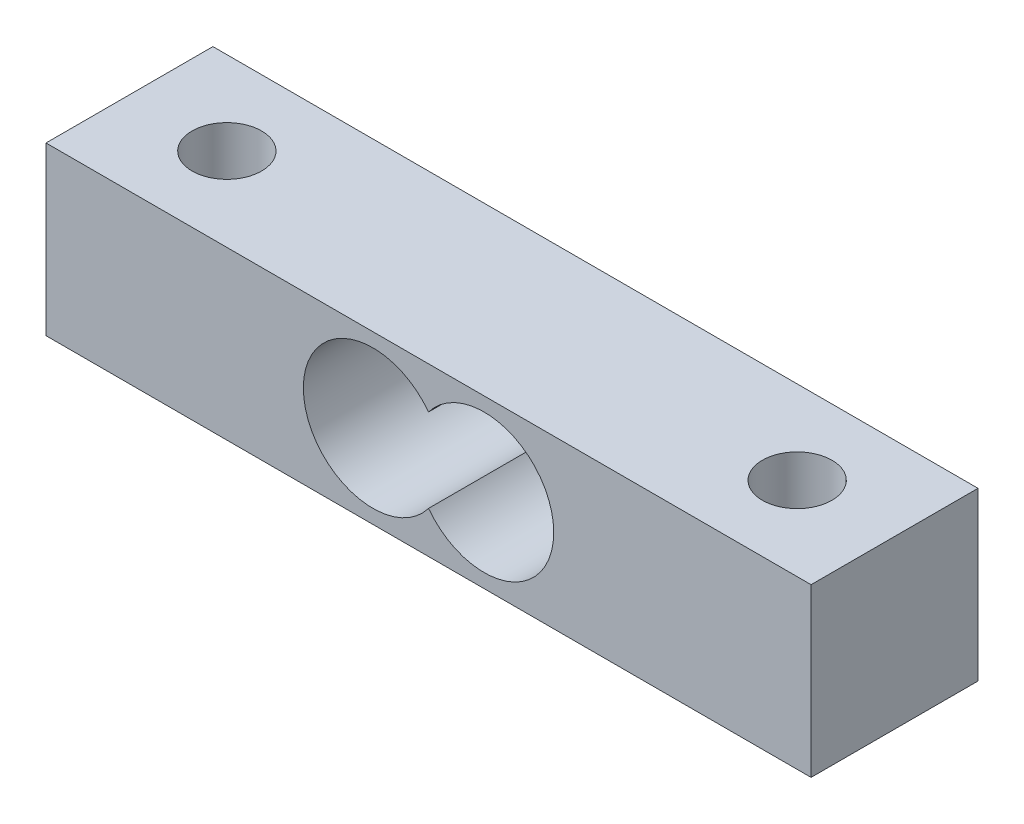
ISO-10303-21;
HEADER;
FILE_DESCRIPTION(('STEP AP214'),'2;1');
FILE_NAME('part.step','',(''),(''),'','','');
FILE_SCHEMA(('AUTOMOTIVE_DESIGN { 1 0 10303 214 1 1 1 1 }'));
ENDSEC;
DATA;
#1=APPLICATION_CONTEXT('core data for automotive mechanical design processes');
#2=APPLICATION_PROTOCOL_DEFINITION('international standard','automotive_design',2000,#1);
#3=PRODUCT_CONTEXT('',#1,'mechanical');
#4=PRODUCT('Part','Part','',(#3));
#5=PRODUCT_RELATED_PRODUCT_CATEGORY('part','',(#4));
#6=PRODUCT_DEFINITION_FORMATION('','',#4);
#7=PRODUCT_DEFINITION_CONTEXT('part definition',#1,'design');
#8=PRODUCT_DEFINITION('design','',#6,#7);
#9=PRODUCT_DEFINITION_SHAPE('','',#8);
#10=(LENGTH_UNIT() NAMED_UNIT(*) SI_UNIT(.MILLI.,.METRE.));
#11=(NAMED_UNIT(*) PLANE_ANGLE_UNIT() SI_UNIT($,.RADIAN.));
#12=(NAMED_UNIT(*) SI_UNIT($,.STERADIAN.) SOLID_ANGLE_UNIT());
#13=UNCERTAINTY_MEASURE_WITH_UNIT(LENGTH_MEASURE(1.E-05),#10,'distance_accuracy_value','');
#14=(GEOMETRIC_REPRESENTATION_CONTEXT(3) GLOBAL_UNCERTAINTY_ASSIGNED_CONTEXT((#13)) GLOBAL_UNIT_ASSIGNED_CONTEXT((#10,
#11,#12)) REPRESENTATION_CONTEXT('',''));
#15=CARTESIAN_POINT('',(0.,0.,0.));
#16=DIRECTION('',(0.,0.,1.));
#17=DIRECTION('',(1.,0.,0.));
#18=AXIS2_PLACEMENT_3D('',#15,#16,#17);
#19=CARTESIAN_POINT('',(0.,0.,12.));
#20=DIRECTION('',(0.,0.,-1.));
#21=DIRECTION('',(-1.,0.,0.));
#22=AXIS2_PLACEMENT_3D('',#19,#20,#21);
#23=PLANE('',#22);
#24=DIRECTION('',(0.,-1.,0.));
#25=VECTOR('',#24,1.);
#26=CARTESIAN_POINT('',(0.,0.,12.));
#27=LINE('',#26,#25);
#28=CARTESIAN_POINT('',(0.,12.,12.));
#29=VERTEX_POINT('',#28);
#30=CARTESIAN_POINT('',(0.,0.,12.));
#31=VERTEX_POINT('',#30);
#32=EDGE_CURVE('E106',#29,#31,#27,.T.);
#33=ORIENTED_EDGE('',*,*,#32,.T.);
#34=DIRECTION('',(1.,0.,0.));
#35=VECTOR('',#34,1.);
#36=CARTESIAN_POINT('',(0.,0.,12.));
#37=LINE('',#36,#35);
#38=CARTESIAN_POINT('',(55.,0.,12.));
#39=VERTEX_POINT('',#38);
#40=EDGE_CURVE('E109',#31,#39,#37,.T.);
#41=ORIENTED_EDGE('',*,*,#40,.T.);
#42=DIRECTION('',(0.,1.,0.));
#43=VECTOR('',#42,1.);
#44=CARTESIAN_POINT('',(55.,0.,12.));
#45=LINE('',#44,#43);
#46=CARTESIAN_POINT('',(55.,12.,12.));
#47=VERTEX_POINT('',#46);
#48=EDGE_CURVE('E112',#39,#47,#45,.T.);
#49=ORIENTED_EDGE('',*,*,#48,.T.);
#50=DIRECTION('',(-1.,0.,0.));
#51=VECTOR('',#50,1.);
#52=CARTESIAN_POINT('',(0.,12.,12.));
#53=LINE('',#52,#51);
#54=EDGE_CURVE('E114',#47,#29,#53,.T.);
#55=ORIENTED_EDGE('',*,*,#54,.T.);
#56=EDGE_LOOP('',(#33,#41,#49,#55));
#57=FACE_BOUND('',#56,.T.);
#58=CARTESIAN_POINT('',(31.5,6.,12.));
#59=DIRECTION('',(0.,0.,1.));
#60=DIRECTION('',(-1.,0.,0.));
#61=AXIS2_PLACEMENT_3D('',#58,#59,#60);
#62=CIRCLE('',#61,5.);
#63=CARTESIAN_POINT('',(27.5,3.00000000000001,12.));
#64=VERTEX_POINT('',#63);
#65=CARTESIAN_POINT('',(27.5,9.,12.));
#66=VERTEX_POINT('',#65);
#67=EDGE_CURVE('E91',#64,#66,#62,.T.);
#68=ORIENTED_EDGE('',*,*,#67,.F.);
#69=CARTESIAN_POINT('',(23.5,6.,12.));
#70=DIRECTION('',(0.,0.,1.));
#71=DIRECTION('',(1.,0.,0.));
#72=AXIS2_PLACEMENT_3D('',#69,#70,#71);
#73=CIRCLE('',#72,5.);
#74=EDGE_CURVE('E85',#66,#64,#73,.T.);
#75=ORIENTED_EDGE('',*,*,#74,.F.);
#76=EDGE_LOOP('',(#68,#75));
#77=FACE_BOUND('',#76,.T.);
#78=ADVANCED_FACE('F33',(#57,#77),#23,.F.);
#79=CARTESIAN_POINT('',(0.,0.,0.));
#80=DIRECTION('',(0.,0.,-1.));
#81=DIRECTION('',(-1.,0.,0.));
#82=AXIS2_PLACEMENT_3D('',#79,#80,#81);
#83=PLANE('',#82);
#84=DIRECTION('',(0.,-1.,0.));
#85=VECTOR('',#84,1.);
#86=CARTESIAN_POINT('',(0.,0.,0.));
#87=LINE('',#86,#85);
#88=CARTESIAN_POINT('',(0.,12.,0.));
#89=VERTEX_POINT('',#88);
#90=CARTESIAN_POINT('',(0.,0.,0.));
#91=VERTEX_POINT('',#90);
#92=EDGE_CURVE('E105',#89,#91,#87,.T.);
#93=ORIENTED_EDGE('',*,*,#92,.F.);
#94=DIRECTION('',(-1.,0.,0.));
#95=VECTOR('',#94,1.);
#96=CARTESIAN_POINT('',(0.,12.,0.));
#97=LINE('',#96,#95);
#98=CARTESIAN_POINT('',(55.,12.,0.));
#99=VERTEX_POINT('',#98);
#100=EDGE_CURVE('E110',#99,#89,#97,.T.);
#101=ORIENTED_EDGE('',*,*,#100,.F.);
#102=DIRECTION('',(0.,1.,0.));
#103=VECTOR('',#102,1.);
#104=CARTESIAN_POINT('',(55.,0.,0.));
#105=LINE('',#104,#103);
#106=CARTESIAN_POINT('',(55.,0.,0.));
#107=VERTEX_POINT('',#106);
#108=EDGE_CURVE('E121',#107,#99,#105,.T.);
#109=ORIENTED_EDGE('',*,*,#108,.F.);
#110=DIRECTION('',(1.,0.,0.));
#111=VECTOR('',#110,1.);
#112=CARTESIAN_POINT('',(0.,0.,0.));
#113=LINE('',#112,#111);
#114=EDGE_CURVE('E119',#91,#107,#113,.T.);
#115=ORIENTED_EDGE('',*,*,#114,.F.);
#116=EDGE_LOOP('',(#93,#101,#109,#115));
#117=FACE_BOUND('',#116,.T.);
#118=CARTESIAN_POINT('',(23.5,6.,0.));
#119=DIRECTION('',(0.,0.,1.));
#120=DIRECTION('',(1.,0.,0.));
#121=AXIS2_PLACEMENT_3D('',#118,#119,#120);
#122=CIRCLE('',#121,5.);
#123=CARTESIAN_POINT('',(27.5,9.,0.));
#124=VERTEX_POINT('',#123);
#125=CARTESIAN_POINT('',(27.5,3.00000000000001,0.));
#126=VERTEX_POINT('',#125);
#127=EDGE_CURVE('E95',#124,#126,#122,.T.);
#128=ORIENTED_EDGE('',*,*,#127,.T.);
#129=CARTESIAN_POINT('',(31.5,6.,0.));
#130=DIRECTION('',(0.,0.,1.));
#131=DIRECTION('',(-1.,0.,0.));
#132=AXIS2_PLACEMENT_3D('',#129,#130,#131);
#133=CIRCLE('',#132,5.);
#134=EDGE_CURVE('E55',#126,#124,#133,.T.);
#135=ORIENTED_EDGE('',*,*,#134,.T.);
#136=EDGE_LOOP('',(#128,#135));
#137=FACE_BOUND('',#136,.T.);
#138=ADVANCED_FACE('F139',(#117,#137),#83,.T.);
#139=CARTESIAN_POINT('',(0.,0.,12.));
#140=DIRECTION('',(1.,0.,0.));
#141=DIRECTION('',(0.,0.,-1.));
#142=AXIS2_PLACEMENT_3D('',#139,#140,#141);
#143=PLANE('',#142);
#144=ORIENTED_EDGE('',*,*,#92,.T.);
#145=DIRECTION('',(0.,0.,-1.));
#146=VECTOR('',#145,1.);
#147=CARTESIAN_POINT('',(0.,0.,12.));
#148=LINE('',#147,#146);
#149=EDGE_CURVE('E11',#31,#91,#148,.T.);
#150=ORIENTED_EDGE('',*,*,#149,.F.);
#151=ORIENTED_EDGE('',*,*,#32,.F.);
#152=DIRECTION('',(0.,0.,-1.));
#153=VECTOR('',#152,1.);
#154=CARTESIAN_POINT('',(0.,12.,12.));
#155=LINE('',#154,#153);
#156=EDGE_CURVE('E116',#29,#89,#155,.T.);
#157=ORIENTED_EDGE('',*,*,#156,.T.);
#158=EDGE_LOOP('',(#144,#150,#151,#157));
#159=FACE_BOUND('',#158,.T.);
#160=ADVANCED_FACE('F35',(#159),#143,.F.);
#161=CARTESIAN_POINT('',(0.,0.,12.));
#162=DIRECTION('',(0.,1.,0.));
#163=DIRECTION('',(0.,0.,1.));
#164=AXIS2_PLACEMENT_3D('',#161,#162,#163);
#165=PLANE('',#164);
#166=CARTESIAN_POINT('',(7.,0.,6.));
#167=DIRECTION('',(0.,1.,0.));
#168=DIRECTION('',(-1.,0.,0.));
#169=AXIS2_PLACEMENT_3D('',#166,#167,#168);
#170=CIRCLE('',#169,2.5);
#171=CARTESIAN_POINT('',(4.5,0.,6.));
#172=VERTEX_POINT('',#171);
#173=EDGE_CURVE('E102',#172,#172,#170,.T.);
#174=ORIENTED_EDGE('',*,*,#173,.T.);
#175=EDGE_LOOP('',(#174));
#176=FACE_BOUND('',#175,.T.);
#177=CARTESIAN_POINT('',(48.,0.,6.));
#178=DIRECTION('',(0.,1.,0.));
#179=DIRECTION('',(1.,0.,0.));
#180=AXIS2_PLACEMENT_3D('',#177,#178,#179);
#181=CIRCLE('',#180,2.5);
#182=CARTESIAN_POINT('',(50.5,0.,6.));
#183=VERTEX_POINT('',#182);
#184=EDGE_CURVE('E182',#183,#183,#181,.T.);
#185=ORIENTED_EDGE('',*,*,#184,.T.);
#186=EDGE_LOOP('',(#185));
#187=FACE_BOUND('',#186,.T.);
#188=ORIENTED_EDGE('',*,*,#114,.T.);
#189=DIRECTION('',(0.,0.,-1.));
#190=VECTOR('',#189,1.);
#191=CARTESIAN_POINT('',(55.,0.,12.));
#192=LINE('',#191,#190);
#193=EDGE_CURVE('E41',#39,#107,#192,.T.);
#194=ORIENTED_EDGE('',*,*,#193,.F.);
#195=ORIENTED_EDGE('',*,*,#40,.F.);
#196=ORIENTED_EDGE('',*,*,#149,.T.);
#197=EDGE_LOOP('',(#188,#194,#195,#196));
#198=FACE_BOUND('',#197,.T.);
#199=ADVANCED_FACE('F149',(#176,#187,#198),#165,.F.);
#200=CARTESIAN_POINT('',(55.,0.,12.));
#201=DIRECTION('',(-1.,0.,0.));
#202=DIRECTION('',(0.,0.,1.));
#203=AXIS2_PLACEMENT_3D('',#200,#201,#202);
#204=PLANE('',#203);
#205=ORIENTED_EDGE('',*,*,#108,.T.);
#206=DIRECTION('',(0.,0.,-1.));
#207=VECTOR('',#206,1.);
#208=CARTESIAN_POINT('',(55.,12.,12.));
#209=LINE('',#208,#207);
#210=EDGE_CURVE('E126',#47,#99,#209,.T.);
#211=ORIENTED_EDGE('',*,*,#210,.F.);
#212=ORIENTED_EDGE('',*,*,#48,.F.);
#213=ORIENTED_EDGE('',*,*,#193,.T.);
#214=EDGE_LOOP('',(#205,#211,#212,#213));
#215=FACE_BOUND('',#214,.T.);
#216=ADVANCED_FACE('F133',(#215),#204,.F.);
#217=CARTESIAN_POINT('',(0.,12.,12.));
#218=DIRECTION('',(0.,-1.,0.));
#219=DIRECTION('',(1.,0.,0.));
#220=AXIS2_PLACEMENT_3D('',#217,#218,#219);
#221=PLANE('',#220);
#222=CARTESIAN_POINT('',(7.,12.,6.));
#223=DIRECTION('',(0.,1.,0.));
#224=DIRECTION('',(-1.,0.,0.));
#225=AXIS2_PLACEMENT_3D('',#222,#223,#224);
#226=CIRCLE('',#225,2.5);
#227=CARTESIAN_POINT('',(4.5,12.,6.));
#228=VERTEX_POINT('',#227);
#229=EDGE_CURVE('E178',#228,#228,#226,.T.);
#230=ORIENTED_EDGE('',*,*,#229,.F.);
#231=EDGE_LOOP('',(#230));
#232=FACE_BOUND('',#231,.T.);
#233=CARTESIAN_POINT('',(48.,12.,6.));
#234=DIRECTION('',(0.,1.,0.));
#235=DIRECTION('',(1.,0.,0.));
#236=AXIS2_PLACEMENT_3D('',#233,#234,#235);
#237=CIRCLE('',#236,2.5);
#238=CARTESIAN_POINT('',(50.5,12.,6.));
#239=VERTEX_POINT('',#238);
#240=EDGE_CURVE('E99',#239,#239,#237,.T.);
#241=ORIENTED_EDGE('',*,*,#240,.F.);
#242=EDGE_LOOP('',(#241));
#243=FACE_BOUND('',#242,.T.);
#244=ORIENTED_EDGE('',*,*,#100,.T.);
#245=ORIENTED_EDGE('',*,*,#156,.F.);
#246=ORIENTED_EDGE('',*,*,#54,.F.);
#247=ORIENTED_EDGE('',*,*,#210,.T.);
#248=EDGE_LOOP('',(#244,#245,#246,#247));
#249=FACE_BOUND('',#248,.T.);
#250=ADVANCED_FACE('F143',(#232,#243,#249),#221,.F.);
#251=CARTESIAN_POINT('',(31.5,6.,12.));
#252=DIRECTION('',(0.,0.,-1.));
#253=DIRECTION('',(-1.,0.,0.));
#254=AXIS2_PLACEMENT_3D('',#251,#252,#253);
#255=CYLINDRICAL_SURFACE('',#254,5.);
#256=ORIENTED_EDGE('',*,*,#134,.F.);
#257=DIRECTION('',(0.,0.,-1.));
#258=VECTOR('',#257,1.);
#259=CARTESIAN_POINT('',(27.5,3.00000000000001,12.));
#260=LINE('',#259,#258);
#261=EDGE_CURVE('E87',#64,#126,#260,.T.);
#262=ORIENTED_EDGE('',*,*,#261,.F.);
#263=ORIENTED_EDGE('',*,*,#67,.T.);
#264=DIRECTION('',(0.,0.,-1.));
#265=VECTOR('',#264,1.);
#266=CARTESIAN_POINT('',(27.5,9.,12.));
#267=LINE('',#266,#265);
#268=EDGE_CURVE('E48',#66,#124,#267,.T.);
#269=ORIENTED_EDGE('',*,*,#268,.T.);
#270=EDGE_LOOP('',(#256,#262,#263,#269));
#271=FACE_BOUND('',#270,.T.);
#272=ADVANCED_FACE('F93',(#271),#255,.F.);
#273=CARTESIAN_POINT('',(23.5,6.,12.));
#274=DIRECTION('',(0.,0.,-1.));
#275=DIRECTION('',(-1.,0.,0.));
#276=AXIS2_PLACEMENT_3D('',#273,#274,#275);
#277=CYLINDRICAL_SURFACE('',#276,5.);
#278=ORIENTED_EDGE('',*,*,#127,.F.);
#279=ORIENTED_EDGE('',*,*,#268,.F.);
#280=ORIENTED_EDGE('',*,*,#74,.T.);
#281=ORIENTED_EDGE('',*,*,#261,.T.);
#282=EDGE_LOOP('',(#278,#279,#280,#281));
#283=FACE_BOUND('',#282,.T.);
#284=ADVANCED_FACE('F86',(#283),#277,.F.);
#285=CARTESIAN_POINT('',(48.,0.,6.));
#286=DIRECTION('',(0.,1.,0.));
#287=DIRECTION('',(-1.,0.,0.));
#288=AXIS2_PLACEMENT_3D('',#285,#286,#287);
#289=CYLINDRICAL_SURFACE('',#288,2.5);
#290=ORIENTED_EDGE('',*,*,#184,.F.);
#291=EDGE_LOOP('',(#290));
#292=FACE_BOUND('',#291,.T.);
#293=ORIENTED_EDGE('',*,*,#240,.T.);
#294=EDGE_LOOP('',(#293));
#295=FACE_BOUND('',#294,.T.);
#296=ADVANCED_FACE('F192',(#292,#295),#289,.F.);
#297=CARTESIAN_POINT('',(7.,0.,6.));
#298=DIRECTION('',(0.,1.,0.));
#299=DIRECTION('',(-1.,0.,0.));
#300=AXIS2_PLACEMENT_3D('',#297,#298,#299);
#301=CYLINDRICAL_SURFACE('',#300,2.5);
#302=ORIENTED_EDGE('',*,*,#173,.F.);
#303=EDGE_LOOP('',(#302));
#304=FACE_BOUND('',#303,.T.);
#305=ORIENTED_EDGE('',*,*,#229,.T.);
#306=EDGE_LOOP('',(#305));
#307=FACE_BOUND('',#306,.T.);
#308=ADVANCED_FACE('F189',(#304,#307),#301,.F.);
#309=CLOSED_SHELL('',(#78,#138,#160,#199,#216,#250,#272,#284,#296,#308));
#310=MANIFOLD_SOLID_BREP('B2',#309);
#311=ADVANCED_BREP_SHAPE_REPRESENTATION('',(#18,#310),#14);
#312=SHAPE_DEFINITION_REPRESENTATION(#9,#311);
ENDSEC;
END-ISO-10303-21;
